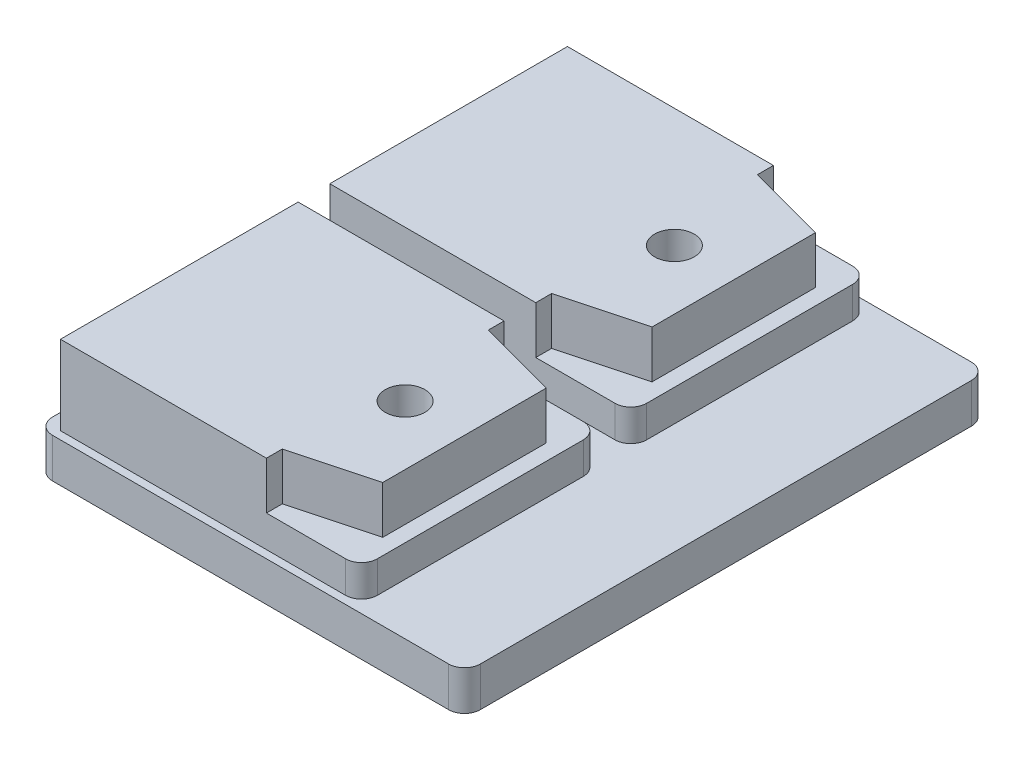
ISO-10303-21;
HEADER;
FILE_DESCRIPTION(('STEP AP214'),'2;1');
FILE_NAME('part.step','',(''),(''),'','','');
FILE_SCHEMA(('AUTOMOTIVE_DESIGN { 1 0 10303 214 1 1 1 1 }'));
ENDSEC;
DATA;
#1=APPLICATION_CONTEXT('core data for automotive mechanical design processes');
#2=APPLICATION_PROTOCOL_DEFINITION('international standard','automotive_design',2000,#1);
#3=PRODUCT_CONTEXT('',#1,'mechanical');
#4=PRODUCT('Part','Part','',(#3));
#5=PRODUCT_RELATED_PRODUCT_CATEGORY('part','',(#4));
#6=PRODUCT_DEFINITION_FORMATION('','',#4);
#7=PRODUCT_DEFINITION_CONTEXT('part definition',#1,'design');
#8=PRODUCT_DEFINITION('design','',#6,#7);
#9=PRODUCT_DEFINITION_SHAPE('','',#8);
#10=(LENGTH_UNIT() NAMED_UNIT(*) SI_UNIT(.MILLI.,.METRE.));
#11=(NAMED_UNIT(*) PLANE_ANGLE_UNIT() SI_UNIT($,.RADIAN.));
#12=(NAMED_UNIT(*) SI_UNIT($,.STERADIAN.) SOLID_ANGLE_UNIT());
#13=UNCERTAINTY_MEASURE_WITH_UNIT(LENGTH_MEASURE(1.E-05),#10,'distance_accuracy_value','');
#14=(GEOMETRIC_REPRESENTATION_CONTEXT(3) GLOBAL_UNCERTAINTY_ASSIGNED_CONTEXT((#13)) GLOBAL_UNIT_ASSIGNED_CONTEXT((#10,
#11,#12)) REPRESENTATION_CONTEXT('',''));
#15=CARTESIAN_POINT('',(0.,0.,0.));
#16=DIRECTION('',(0.,0.,1.));
#17=DIRECTION('',(1.,0.,0.));
#18=AXIS2_PLACEMENT_3D('',#15,#16,#17);
#19=CARTESIAN_POINT('',(6.5,7.5,-1.));
#20=DIRECTION('',(-1.,0.,0.));
#21=DIRECTION('',(0.,0.,1.));
#22=AXIS2_PLACEMENT_3D('',#19,#20,#21);
#23=PLANE('',#22);
#24=DIRECTION('',(0.,0.,-1.));
#25=VECTOR('',#24,1.);
#26=CARTESIAN_POINT('',(6.5,2.5,-1.));
#27=LINE('',#26,#25);
#28=CARTESIAN_POINT('',(6.5,2.5,-2.));
#29=VERTEX_POINT('',#28);
#30=CARTESIAN_POINT('',(6.5,2.5,-15.));
#31=VERTEX_POINT('',#30);
#32=EDGE_CURVE('E297',#29,#31,#27,.T.);
#33=ORIENTED_EDGE('',*,*,#32,.T.);
#34=DIRECTION('',(0.,-1.,0.));
#35=VECTOR('',#34,1.);
#36=CARTESIAN_POINT('',(6.5,7.5,-15.));
#37=LINE('',#36,#35);
#38=CARTESIAN_POINT('',(6.5,4.5,-15.));
#39=VERTEX_POINT('',#38);
#40=EDGE_CURVE('E465',#31,#39,#37,.F.);
#41=ORIENTED_EDGE('',*,*,#40,.T.);
#42=DIRECTION('',(0.,0.,-1.));
#43=VECTOR('',#42,1.);
#44=CARTESIAN_POINT('',(6.5,4.5,-1.));
#45=LINE('',#44,#43);
#46=CARTESIAN_POINT('',(6.5,4.5,-2.));
#47=VERTEX_POINT('',#46);
#48=EDGE_CURVE('E260',#47,#39,#45,.T.);
#49=ORIENTED_EDGE('',*,*,#48,.F.);
#50=DIRECTION('',(0.,-1.,0.));
#51=VECTOR('',#50,1.);
#52=CARTESIAN_POINT('',(6.5,7.5,-2.));
#53=LINE('',#52,#51);
#54=EDGE_CURVE('E462',#47,#29,#53,.T.);
#55=ORIENTED_EDGE('',*,*,#54,.T.);
#56=EDGE_LOOP('',(#33,#41,#49,#55));
#57=FACE_BOUND('',#56,.T.);
#58=ADVANCED_FACE('F39',(#57),#23,.F.);
#59=CARTESIAN_POINT('',(-13.5,2.5,16.5));
#60=DIRECTION('',(0.,1.,0.));
#61=DIRECTION('',(0.,0.,1.));
#62=AXIS2_PLACEMENT_3D('',#59,#60,#61);
#63=PLANE('',#62);
#64=CARTESIAN_POINT('',(5.5,2.5,-2.));
#65=DIRECTION('',(0.,1.,0.));
#66=DIRECTION('',(0.,0.,1.));
#67=AXIS2_PLACEMENT_3D('',#64,#65,#66);
#68=CIRCLE('',#67,1.);
#69=CARTESIAN_POINT('',(5.5,2.5,-1.));
#70=VERTEX_POINT('',#69);
#71=EDGE_CURVE('E11',#29,#70,#68,.F.);
#72=ORIENTED_EDGE('',*,*,#71,.T.);
#73=DIRECTION('',(1.,0.,0.));
#74=VECTOR('',#73,1.);
#75=CARTESIAN_POINT('',(-12.5,2.5,-1.));
#76=LINE('',#75,#74);
#77=CARTESIAN_POINT('',(-12.5,2.5,-1.));
#78=VERTEX_POINT('',#77);
#79=EDGE_CURVE('E55',#78,#70,#76,.T.);
#80=ORIENTED_EDGE('',*,*,#79,.F.);
#81=DIRECTION('',(0.,0.,1.));
#82=VECTOR('',#81,1.);
#83=CARTESIAN_POINT('',(-12.5,2.5,-1.));
#84=LINE('',#83,#82);
#85=CARTESIAN_POINT('',(-12.5,2.5,-16.));
#86=VERTEX_POINT('',#85);
#87=EDGE_CURVE('E292',#86,#78,#84,.T.);
#88=ORIENTED_EDGE('',*,*,#87,.F.);
#89=DIRECTION('',(-1.,0.,0.));
#90=VECTOR('',#89,1.);
#91=CARTESIAN_POINT('',(-12.5,2.5,-16.));
#92=LINE('',#91,#90);
#93=CARTESIAN_POINT('',(5.5,2.5,-16.));
#94=VERTEX_POINT('',#93);
#95=EDGE_CURVE('E287',#94,#86,#92,.T.);
#96=ORIENTED_EDGE('',*,*,#95,.F.);
#97=CARTESIAN_POINT('',(5.5,2.5,-15.));
#98=DIRECTION('',(0.,1.,0.));
#99=DIRECTION('',(0.,0.,1.));
#100=AXIS2_PLACEMENT_3D('',#97,#98,#99);
#101=CIRCLE('',#100,1.);
#102=EDGE_CURVE('E48',#94,#31,#101,.F.);
#103=ORIENTED_EDGE('',*,*,#102,.T.);
#104=ORIENTED_EDGE('',*,*,#32,.F.);
#105=EDGE_LOOP('',(#72,#80,#88,#96,#103,#104));
#106=FACE_BOUND('',#105,.T.);
#107=DIRECTION('',(0.,0.,1.));
#108=VECTOR('',#107,1.);
#109=CARTESIAN_POINT('',(-12.5,2.5,16.));
#110=LINE('',#109,#108);
#111=CARTESIAN_POINT('',(-12.5,2.5,1.));
#112=VERTEX_POINT('',#111);
#113=CARTESIAN_POINT('',(-12.5,2.5,16.));
#114=VERTEX_POINT('',#113);
#115=EDGE_CURVE('E349',#112,#114,#110,.T.);
#116=ORIENTED_EDGE('',*,*,#115,.F.);
#117=DIRECTION('',(-1.,0.,0.));
#118=VECTOR('',#117,1.);
#119=CARTESIAN_POINT('',(-12.5,2.5,1.));
#120=LINE('',#119,#118);
#121=CARTESIAN_POINT('',(5.5,2.5,0.999999999999999));
#122=VERTEX_POINT('',#121);
#123=EDGE_CURVE('E363',#122,#112,#120,.T.);
#124=ORIENTED_EDGE('',*,*,#123,.F.);
#125=CARTESIAN_POINT('',(5.5,2.5,2.));
#126=DIRECTION('',(0.,1.,0.));
#127=DIRECTION('',(0.,0.,1.));
#128=AXIS2_PLACEMENT_3D('',#125,#126,#127);
#129=CIRCLE('',#128,1.);
#130=CARTESIAN_POINT('',(6.5,2.5,2.));
#131=VERTEX_POINT('',#130);
#132=EDGE_CURVE('E456',#122,#131,#129,.F.);
#133=ORIENTED_EDGE('',*,*,#132,.T.);
#134=DIRECTION('',(0.,0.,-1.));
#135=VECTOR('',#134,1.);
#136=CARTESIAN_POINT('',(6.5,2.5,16.));
#137=LINE('',#136,#135);
#138=CARTESIAN_POINT('',(6.5,2.5,15.));
#139=VERTEX_POINT('',#138);
#140=EDGE_CURVE('E374',#139,#131,#137,.T.);
#141=ORIENTED_EDGE('',*,*,#140,.F.);
#142=CARTESIAN_POINT('',(5.5,2.5,15.));
#143=DIRECTION('',(0.,1.,0.));
#144=DIRECTION('',(0.,0.,1.));
#145=AXIS2_PLACEMENT_3D('',#142,#143,#144);
#146=CIRCLE('',#145,1.);
#147=CARTESIAN_POINT('',(5.5,2.5,16.));
#148=VERTEX_POINT('',#147);
#149=EDGE_CURVE('E458',#139,#148,#146,.F.);
#150=ORIENTED_EDGE('',*,*,#149,.T.);
#151=DIRECTION('',(1.,0.,0.));
#152=VECTOR('',#151,1.);
#153=CARTESIAN_POINT('',(-12.5,2.5,16.));
#154=LINE('',#153,#152);
#155=EDGE_CURVE('E371',#114,#148,#154,.T.);
#156=ORIENTED_EDGE('',*,*,#155,.F.);
#157=EDGE_LOOP('',(#116,#124,#133,#141,#150,#156));
#158=FACE_BOUND('',#157,.T.);
#159=DIRECTION('',(0.,0.,-1.));
#160=VECTOR('',#159,1.);
#161=CARTESIAN_POINT('',(13.5,2.5,-16.5));
#162=LINE('',#161,#160);
#163=CARTESIAN_POINT('',(13.5,2.5,15.5));
#164=VERTEX_POINT('',#163);
#165=CARTESIAN_POINT('',(13.5,2.5,-15.5));
#166=VERTEX_POINT('',#165);
#167=EDGE_CURVE('E390',#164,#166,#162,.T.);
#168=ORIENTED_EDGE('',*,*,#167,.T.);
#169=CARTESIAN_POINT('',(12.5,2.5,-15.5));
#170=DIRECTION('',(0.,1.,0.));
#171=DIRECTION('',(0.,0.,1.));
#172=AXIS2_PLACEMENT_3D('',#169,#170,#171);
#173=CIRCLE('',#172,1.);
#174=CARTESIAN_POINT('',(12.5,2.5,-16.5));
#175=VERTEX_POINT('',#174);
#176=EDGE_CURVE('E430',#166,#175,#173,.T.);
#177=ORIENTED_EDGE('',*,*,#176,.T.);
#178=DIRECTION('',(-1.,0.,0.));
#179=VECTOR('',#178,1.);
#180=CARTESIAN_POINT('',(-13.5,2.5,-16.5));
#181=LINE('',#180,#179);
#182=CARTESIAN_POINT('',(-12.5,2.5,-16.5));
#183=VERTEX_POINT('',#182);
#184=EDGE_CURVE('E393',#175,#183,#181,.T.);
#185=ORIENTED_EDGE('',*,*,#184,.T.);
#186=CARTESIAN_POINT('',(-12.5,2.5,-15.5));
#187=DIRECTION('',(0.,1.,0.));
#188=DIRECTION('',(0.,0.,1.));
#189=AXIS2_PLACEMENT_3D('',#186,#187,#188);
#190=CIRCLE('',#189,1.);
#191=CARTESIAN_POINT('',(-13.5,2.5,-15.5));
#192=VERTEX_POINT('',#191);
#193=EDGE_CURVE('E428',#183,#192,#190,.T.);
#194=ORIENTED_EDGE('',*,*,#193,.T.);
#195=DIRECTION('',(0.,0.,1.));
#196=VECTOR('',#195,1.);
#197=CARTESIAN_POINT('',(-13.5,2.5,-16.5));
#198=LINE('',#197,#196);
#199=CARTESIAN_POINT('',(-13.5,2.5,15.5));
#200=VERTEX_POINT('',#199);
#201=EDGE_CURVE('E383',#192,#200,#198,.T.);
#202=ORIENTED_EDGE('',*,*,#201,.T.);
#203=CARTESIAN_POINT('',(-12.5,2.5,15.5));
#204=DIRECTION('',(0.,1.,0.));
#205=DIRECTION('',(0.,0.,1.));
#206=AXIS2_PLACEMENT_3D('',#203,#204,#205);
#207=CIRCLE('',#206,1.);
#208=CARTESIAN_POINT('',(-12.5,2.5,16.5));
#209=VERTEX_POINT('',#208);
#210=EDGE_CURVE('E426',#200,#209,#207,.T.);
#211=ORIENTED_EDGE('',*,*,#210,.T.);
#212=DIRECTION('',(1.,0.,0.));
#213=VECTOR('',#212,1.);
#214=CARTESIAN_POINT('',(-13.5,2.5,16.5));
#215=LINE('',#214,#213);
#216=CARTESIAN_POINT('',(12.5,2.5,16.5));
#217=VERTEX_POINT('',#216);
#218=EDGE_CURVE('E386',#209,#217,#215,.T.);
#219=ORIENTED_EDGE('',*,*,#218,.T.);
#220=CARTESIAN_POINT('',(12.5,2.5,15.5));
#221=DIRECTION('',(0.,1.,0.));
#222=DIRECTION('',(0.,0.,1.));
#223=AXIS2_PLACEMENT_3D('',#220,#221,#222);
#224=CIRCLE('',#223,1.);
#225=EDGE_CURVE('E424',#217,#164,#224,.T.);
#226=ORIENTED_EDGE('',*,*,#225,.T.);
#227=EDGE_LOOP('',(#168,#177,#185,#194,#202,#211,#219,#226));
#228=FACE_BOUND('',#227,.T.);
#229=ADVANCED_FACE('F474',(#106,#158,#228),#63,.T.);
#230=CARTESIAN_POINT('',(6.5,7.5,16.));
#231=DIRECTION('',(-1.,0.,0.));
#232=DIRECTION('',(0.,0.,1.));
#233=AXIS2_PLACEMENT_3D('',#230,#231,#232);
#234=PLANE('',#233);
#235=ORIENTED_EDGE('',*,*,#140,.T.);
#236=DIRECTION('',(0.,-1.,0.));
#237=VECTOR('',#236,1.);
#238=CARTESIAN_POINT('',(6.5,7.5,2.));
#239=LINE('',#238,#237);
#240=CARTESIAN_POINT('',(6.5,4.5,2.));
#241=VERTEX_POINT('',#240);
#242=EDGE_CURVE('E448',#131,#241,#239,.F.);
#243=ORIENTED_EDGE('',*,*,#242,.T.);
#244=DIRECTION('',(0.,0.,-1.));
#245=VECTOR('',#244,1.);
#246=CARTESIAN_POINT('',(6.5,4.5,16.));
#247=LINE('',#246,#245);
#248=CARTESIAN_POINT('',(6.5,4.5,15.));
#249=VERTEX_POINT('',#248);
#250=EDGE_CURVE('E309',#249,#241,#247,.T.);
#251=ORIENTED_EDGE('',*,*,#250,.F.);
#252=DIRECTION('',(0.,-1.,0.));
#253=VECTOR('',#252,1.);
#254=CARTESIAN_POINT('',(6.5,7.5,15.));
#255=LINE('',#254,#253);
#256=EDGE_CURVE('E445',#249,#139,#255,.T.);
#257=ORIENTED_EDGE('',*,*,#256,.T.);
#258=EDGE_LOOP('',(#235,#243,#251,#257));
#259=FACE_BOUND('',#258,.T.);
#260=ADVANCED_FACE('F554',(#259),#234,.F.);
#261=CARTESIAN_POINT('',(-13.5,2.5,-16.5));
#262=DIRECTION('',(1.,0.,0.));
#263=DIRECTION('',(0.,0.,-1.));
#264=AXIS2_PLACEMENT_3D('',#261,#262,#263);
#265=PLANE('',#264);
#266=ORIENTED_EDGE('',*,*,#201,.F.);
#267=DIRECTION('',(0.,-1.,0.));
#268=VECTOR('',#267,1.);
#269=CARTESIAN_POINT('',(-13.5,2.5,-15.5));
#270=LINE('',#269,#268);
#271=CARTESIAN_POINT('',(-13.5,0.,-15.5));
#272=VERTEX_POINT('',#271);
#273=EDGE_CURVE('E434',#192,#272,#270,.T.);
#274=ORIENTED_EDGE('',*,*,#273,.T.);
#275=DIRECTION('',(0.,0.,1.));
#276=VECTOR('',#275,1.);
#277=CARTESIAN_POINT('',(-13.5,0.,-16.5));
#278=LINE('',#277,#276);
#279=CARTESIAN_POINT('',(-13.5,0.,15.5));
#280=VERTEX_POINT('',#279);
#281=EDGE_CURVE('E382',#272,#280,#278,.T.);
#282=ORIENTED_EDGE('',*,*,#281,.T.);
#283=DIRECTION('',(0.,-1.,0.));
#284=VECTOR('',#283,1.);
#285=CARTESIAN_POINT('',(-13.5,2.5,15.5));
#286=LINE('',#285,#284);
#287=EDGE_CURVE('E432',#280,#200,#286,.F.);
#288=ORIENTED_EDGE('',*,*,#287,.T.);
#289=EDGE_LOOP('',(#266,#274,#282,#288));
#290=FACE_BOUND('',#289,.T.);
#291=ADVANCED_FACE('F603',(#290),#265,.F.);
#292=CARTESIAN_POINT('',(-13.5,2.5,16.5));
#293=DIRECTION('',(0.,0.,-1.));
#294=DIRECTION('',(-1.,0.,0.));
#295=AXIS2_PLACEMENT_3D('',#292,#293,#294);
#296=PLANE('',#295);
#297=ORIENTED_EDGE('',*,*,#218,.F.);
#298=DIRECTION('',(0.,-1.,0.));
#299=VECTOR('',#298,1.);
#300=CARTESIAN_POINT('',(-12.5,2.5,16.5));
#301=LINE('',#300,#299);
#302=CARTESIAN_POINT('',(-12.5,0.,16.5));
#303=VERTEX_POINT('',#302);
#304=EDGE_CURVE('E439',#209,#303,#301,.T.);
#305=ORIENTED_EDGE('',*,*,#304,.T.);
#306=DIRECTION('',(1.,0.,0.));
#307=VECTOR('',#306,1.);
#308=CARTESIAN_POINT('',(-13.5,0.,16.5));
#309=LINE('',#308,#307);
#310=CARTESIAN_POINT('',(12.5,0.,16.5));
#311=VERTEX_POINT('',#310);
#312=EDGE_CURVE('E399',#303,#311,#309,.T.);
#313=ORIENTED_EDGE('',*,*,#312,.T.);
#314=DIRECTION('',(0.,-1.,0.));
#315=VECTOR('',#314,1.);
#316=CARTESIAN_POINT('',(12.5,2.5,16.5));
#317=LINE('',#316,#315);
#318=EDGE_CURVE('E437',#311,#217,#317,.F.);
#319=ORIENTED_EDGE('',*,*,#318,.T.);
#320=EDGE_LOOP('',(#297,#305,#313,#319));
#321=FACE_BOUND('',#320,.T.);
#322=ADVANCED_FACE('F625',(#321),#296,.F.);
#323=CARTESIAN_POINT('',(13.5,2.5,-16.5));
#324=DIRECTION('',(-1.,0.,0.));
#325=DIRECTION('',(0.,0.,1.));
#326=AXIS2_PLACEMENT_3D('',#323,#324,#325);
#327=PLANE('',#326);
#328=DIRECTION('',(0.,0.,-1.));
#329=VECTOR('',#328,1.);
#330=CARTESIAN_POINT('',(13.5,0.,-16.5));
#331=LINE('',#330,#329);
#332=CARTESIAN_POINT('',(13.5,0.,15.5));
#333=VERTEX_POINT('',#332);
#334=CARTESIAN_POINT('',(13.5,0.,-15.5));
#335=VERTEX_POINT('',#334);
#336=EDGE_CURVE('E402',#333,#335,#331,.T.);
#337=ORIENTED_EDGE('',*,*,#336,.T.);
#338=DIRECTION('',(0.,-1.,0.));
#339=VECTOR('',#338,1.);
#340=CARTESIAN_POINT('',(13.5,2.5,-15.5));
#341=LINE('',#340,#339);
#342=EDGE_CURVE('E422',#335,#166,#341,.F.);
#343=ORIENTED_EDGE('',*,*,#342,.T.);
#344=ORIENTED_EDGE('',*,*,#167,.F.);
#345=DIRECTION('',(0.,-1.,0.));
#346=VECTOR('',#345,1.);
#347=CARTESIAN_POINT('',(13.5,2.5,15.5));
#348=LINE('',#347,#346);
#349=EDGE_CURVE('E419',#164,#333,#348,.T.);
#350=ORIENTED_EDGE('',*,*,#349,.T.);
#351=EDGE_LOOP('',(#337,#343,#344,#350));
#352=FACE_BOUND('',#351,.T.);
#353=ADVANCED_FACE('F621',(#352),#327,.F.);
#354=CARTESIAN_POINT('',(-13.5,2.5,-16.5));
#355=DIRECTION('',(0.,0.,1.));
#356=DIRECTION('',(1.,0.,0.));
#357=AXIS2_PLACEMENT_3D('',#354,#355,#356);
#358=PLANE('',#357);
#359=ORIENTED_EDGE('',*,*,#184,.F.);
#360=DIRECTION('',(0.,-1.,0.));
#361=VECTOR('',#360,1.);
#362=CARTESIAN_POINT('',(12.5,2.5,-16.5));
#363=LINE('',#362,#361);
#364=CARTESIAN_POINT('',(12.5,0.,-16.5));
#365=VERTEX_POINT('',#364);
#366=EDGE_CURVE('E408',#175,#365,#363,.T.);
#367=ORIENTED_EDGE('',*,*,#366,.T.);
#368=DIRECTION('',(-1.,0.,0.));
#369=VECTOR('',#368,1.);
#370=CARTESIAN_POINT('',(-13.5,0.,-16.5));
#371=LINE('',#370,#369);
#372=CARTESIAN_POINT('',(-12.5,0.,-16.5));
#373=VERTEX_POINT('',#372);
#374=EDGE_CURVE('E387',#365,#373,#371,.T.);
#375=ORIENTED_EDGE('',*,*,#374,.T.);
#376=DIRECTION('',(0.,-1.,0.));
#377=VECTOR('',#376,1.);
#378=CARTESIAN_POINT('',(-12.5,2.5,-16.5));
#379=LINE('',#378,#377);
#380=EDGE_CURVE('E396',#373,#183,#379,.F.);
#381=ORIENTED_EDGE('',*,*,#380,.T.);
#382=EDGE_LOOP('',(#359,#367,#375,#381));
#383=FACE_BOUND('',#382,.T.);
#384=ADVANCED_FACE('F617',(#383),#358,.F.);
#385=CARTESIAN_POINT('',(-13.5,0.,16.5));
#386=DIRECTION('',(0.,1.,0.));
#387=DIRECTION('',(0.,0.,1.));
#388=AXIS2_PLACEMENT_3D('',#385,#386,#387);
#389=PLANE('',#388);
#390=ORIENTED_EDGE('',*,*,#374,.F.);
#391=CARTESIAN_POINT('',(12.5,0.,-15.5));
#392=DIRECTION('',(0.,1.,0.));
#393=DIRECTION('',(0.,0.,1.));
#394=AXIS2_PLACEMENT_3D('',#391,#392,#393);
#395=CIRCLE('',#394,1.);
#396=EDGE_CURVE('E417',#365,#335,#395,.F.);
#397=ORIENTED_EDGE('',*,*,#396,.T.);
#398=ORIENTED_EDGE('',*,*,#336,.F.);
#399=CARTESIAN_POINT('',(12.5,0.,15.5));
#400=DIRECTION('',(0.,1.,0.));
#401=DIRECTION('',(0.,0.,1.));
#402=AXIS2_PLACEMENT_3D('',#399,#400,#401);
#403=CIRCLE('',#402,1.);
#404=EDGE_CURVE('E411',#333,#311,#403,.F.);
#405=ORIENTED_EDGE('',*,*,#404,.T.);
#406=ORIENTED_EDGE('',*,*,#312,.F.);
#407=CARTESIAN_POINT('',(-12.5,0.,15.5));
#408=DIRECTION('',(0.,1.,0.));
#409=DIRECTION('',(0.,0.,1.));
#410=AXIS2_PLACEMENT_3D('',#407,#408,#409);
#411=CIRCLE('',#410,1.);
#412=EDGE_CURVE('E413',#303,#280,#411,.F.);
#413=ORIENTED_EDGE('',*,*,#412,.T.);
#414=ORIENTED_EDGE('',*,*,#281,.F.);
#415=CARTESIAN_POINT('',(-12.5,0.,-15.5));
#416=DIRECTION('',(0.,1.,0.));
#417=DIRECTION('',(0.,0.,1.));
#418=AXIS2_PLACEMENT_3D('',#415,#416,#417);
#419=CIRCLE('',#418,1.);
#420=EDGE_CURVE('E415',#272,#373,#419,.F.);
#421=ORIENTED_EDGE('',*,*,#420,.T.);
#422=EDGE_LOOP('',(#390,#397,#398,#405,#406,#413,#414,#421));
#423=FACE_BOUND('',#422,.T.);
#424=ADVANCED_FACE('F613',(#423),#389,.F.);
#425=CARTESIAN_POINT('',(12.5,2.5,-15.5));
#426=DIRECTION('',(0.,-1.,0.));
#427=DIRECTION('',(0.,0.,-1.));
#428=AXIS2_PLACEMENT_3D('',#425,#426,#427);
#429=CYLINDRICAL_SURFACE('',#428,1.);
#430=ORIENTED_EDGE('',*,*,#176,.F.);
#431=ORIENTED_EDGE('',*,*,#342,.F.);
#432=ORIENTED_EDGE('',*,*,#396,.F.);
#433=ORIENTED_EDGE('',*,*,#366,.F.);
#434=EDGE_LOOP('',(#430,#431,#432,#433));
#435=FACE_BOUND('',#434,.T.);
#436=ADVANCED_FACE('F616',(#435),#429,.T.);
#437=CARTESIAN_POINT('',(-12.5,2.5,-15.5));
#438=DIRECTION('',(0.,-1.,0.));
#439=DIRECTION('',(0.,0.,-1.));
#440=AXIS2_PLACEMENT_3D('',#437,#438,#439);
#441=CYLINDRICAL_SURFACE('',#440,1.);
#442=ORIENTED_EDGE('',*,*,#193,.F.);
#443=ORIENTED_EDGE('',*,*,#380,.F.);
#444=ORIENTED_EDGE('',*,*,#420,.F.);
#445=ORIENTED_EDGE('',*,*,#273,.F.);
#446=EDGE_LOOP('',(#442,#443,#444,#445));
#447=FACE_BOUND('',#446,.T.);
#448=ADVANCED_FACE('F635',(#447),#441,.T.);
#449=CARTESIAN_POINT('',(-12.5,2.5,15.5));
#450=DIRECTION('',(0.,-1.,0.));
#451=DIRECTION('',(0.,0.,-1.));
#452=AXIS2_PLACEMENT_3D('',#449,#450,#451);
#453=CYLINDRICAL_SURFACE('',#452,1.);
#454=ORIENTED_EDGE('',*,*,#210,.F.);
#455=ORIENTED_EDGE('',*,*,#287,.F.);
#456=ORIENTED_EDGE('',*,*,#412,.F.);
#457=ORIENTED_EDGE('',*,*,#304,.F.);
#458=EDGE_LOOP('',(#454,#455,#456,#457));
#459=FACE_BOUND('',#458,.T.);
#460=ADVANCED_FACE('F639',(#459),#453,.T.);
#461=CARTESIAN_POINT('',(12.5,2.5,15.5));
#462=DIRECTION('',(0.,-1.,0.));
#463=DIRECTION('',(0.,0.,-1.));
#464=AXIS2_PLACEMENT_3D('',#461,#462,#463);
#465=CYLINDRICAL_SURFACE('',#464,1.);
#466=ORIENTED_EDGE('',*,*,#225,.F.);
#467=ORIENTED_EDGE('',*,*,#318,.F.);
#468=ORIENTED_EDGE('',*,*,#404,.F.);
#469=ORIENTED_EDGE('',*,*,#349,.F.);
#470=EDGE_LOOP('',(#466,#467,#468,#469));
#471=FACE_BOUND('',#470,.T.);
#472=ADVANCED_FACE('F610',(#471),#465,.T.);
#473=CARTESIAN_POINT('',(-12.5,7.5,16.));
#474=DIRECTION('',(1.,0.,0.));
#475=DIRECTION('',(0.,0.,-1.));
#476=AXIS2_PLACEMENT_3D('',#473,#474,#475);
#477=PLANE('',#476);
#478=ORIENTED_EDGE('',*,*,#115,.T.);
#479=DIRECTION('',(0.,-1.,0.));
#480=VECTOR('',#479,1.);
#481=CARTESIAN_POINT('',(-12.5,7.5,16.));
#482=LINE('',#481,#480);
#483=CARTESIAN_POINT('',(-12.5,7.5,16.));
#484=VERTEX_POINT('',#483);
#485=EDGE_CURVE('E380',#484,#114,#482,.T.);
#486=ORIENTED_EDGE('',*,*,#485,.F.);
#487=DIRECTION('',(0.,0.,1.));
#488=VECTOR('',#487,1.);
#489=CARTESIAN_POINT('',(-12.5,7.5,16.));
#490=LINE('',#489,#488);
#491=CARTESIAN_POINT('',(-12.5,7.5,1.));
#492=VERTEX_POINT('',#491);
#493=EDGE_CURVE('E359',#492,#484,#490,.T.);
#494=ORIENTED_EDGE('',*,*,#493,.F.);
#495=DIRECTION('',(0.,-1.,0.));
#496=VECTOR('',#495,1.);
#497=CARTESIAN_POINT('',(-12.5,7.5,1.));
#498=LINE('',#497,#496);
#499=EDGE_CURVE('E368',#492,#112,#498,.T.);
#500=ORIENTED_EDGE('',*,*,#499,.T.);
#501=EDGE_LOOP('',(#478,#486,#494,#500));
#502=FACE_BOUND('',#501,.T.);
#503=ADVANCED_FACE('F607',(#502),#477,.F.);
#504=CARTESIAN_POINT('',(-12.5,7.5,16.));
#505=DIRECTION('',(0.,0.,-1.));
#506=DIRECTION('',(-1.,0.,0.));
#507=AXIS2_PLACEMENT_3D('',#504,#505,#506);
#508=PLANE('',#507);
#509=ORIENTED_EDGE('',*,*,#155,.T.);
#510=DIRECTION('',(0.,-1.,0.));
#511=VECTOR('',#510,1.);
#512=CARTESIAN_POINT('',(5.5,7.5,16.));
#513=LINE('',#512,#511);
#514=CARTESIAN_POINT('',(5.5,4.5,16.));
#515=VERTEX_POINT('',#514);
#516=EDGE_CURVE('E454',#148,#515,#513,.F.);
#517=ORIENTED_EDGE('',*,*,#516,.T.);
#518=DIRECTION('',(1.,0.,0.));
#519=VECTOR('',#518,1.);
#520=CARTESIAN_POINT('',(0.499999999999999,4.5,16.));
#521=LINE('',#520,#519);
#522=CARTESIAN_POINT('',(0.499999999999999,4.5,16.));
#523=VERTEX_POINT('',#522);
#524=EDGE_CURVE('E330',#523,#515,#521,.T.);
#525=ORIENTED_EDGE('',*,*,#524,.F.);
#526=DIRECTION('',(0.,1.,0.));
#527=VECTOR('',#526,1.);
#528=CARTESIAN_POINT('',(0.499999999999999,4.5,16.));
#529=LINE('',#528,#527);
#530=CARTESIAN_POINT('',(0.499999999999999,7.5,16.));
#531=VERTEX_POINT('',#530);
#532=EDGE_CURVE('E346',#523,#531,#529,.T.);
#533=ORIENTED_EDGE('',*,*,#532,.T.);
#534=DIRECTION('',(1.,0.,0.));
#535=VECTOR('',#534,1.);
#536=CARTESIAN_POINT('',(-12.5,7.5,16.));
#537=LINE('',#536,#535);
#538=EDGE_CURVE('E362',#484,#531,#537,.T.);
#539=ORIENTED_EDGE('',*,*,#538,.F.);
#540=ORIENTED_EDGE('',*,*,#485,.T.);
#541=EDGE_LOOP('',(#509,#517,#525,#533,#539,#540));
#542=FACE_BOUND('',#541,.T.);
#543=ADVANCED_FACE('F599',(#542),#508,.F.);
#544=CARTESIAN_POINT('',(-12.5,7.5,1.));
#545=DIRECTION('',(0.,0.,1.));
#546=DIRECTION('',(1.,0.,0.));
#547=AXIS2_PLACEMENT_3D('',#544,#545,#546);
#548=PLANE('',#547);
#549=DIRECTION('',(-1.,0.,0.));
#550=VECTOR('',#549,1.);
#551=CARTESIAN_POINT('',(6.5,4.5,0.999999999999999));
#552=LINE('',#551,#550);
#553=CARTESIAN_POINT('',(5.5,4.5,0.999999999999999));
#554=VERTEX_POINT('',#553);
#555=CARTESIAN_POINT('',(0.499999999999999,4.5,0.999999999999999));
#556=VERTEX_POINT('',#555);
#557=EDGE_CURVE('E312',#554,#556,#552,.T.);
#558=ORIENTED_EDGE('',*,*,#557,.F.);
#559=DIRECTION('',(0.,-1.,0.));
#560=VECTOR('',#559,1.);
#561=CARTESIAN_POINT('',(5.5,7.5,0.999999999999999));
#562=LINE('',#561,#560);
#563=EDGE_CURVE('E442',#554,#122,#562,.T.);
#564=ORIENTED_EDGE('',*,*,#563,.T.);
#565=ORIENTED_EDGE('',*,*,#123,.T.);
#566=ORIENTED_EDGE('',*,*,#499,.F.);
#567=DIRECTION('',(-1.,0.,0.));
#568=VECTOR('',#567,1.);
#569=CARTESIAN_POINT('',(-12.5,7.5,1.));
#570=LINE('',#569,#568);
#571=CARTESIAN_POINT('',(0.499999999999999,7.5,0.999999999999999));
#572=VERTEX_POINT('',#571);
#573=EDGE_CURVE('E366',#572,#492,#570,.T.);
#574=ORIENTED_EDGE('',*,*,#573,.F.);
#575=DIRECTION('',(0.,1.,0.));
#576=VECTOR('',#575,1.);
#577=CARTESIAN_POINT('',(0.499999999999999,4.5,0.999999999999999));
#578=LINE('',#577,#576);
#579=EDGE_CURVE('E333',#556,#572,#578,.T.);
#580=ORIENTED_EDGE('',*,*,#579,.F.);
#581=EDGE_LOOP('',(#558,#564,#565,#566,#574,#580));
#582=FACE_BOUND('',#581,.T.);
#583=ADVANCED_FACE('F595',(#582),#548,.F.);
#584=CARTESIAN_POINT('',(-12.5,7.5,1.));
#585=DIRECTION('',(0.,-1.,0.));
#586=DIRECTION('',(0.,0.,-1.));
#587=AXIS2_PLACEMENT_3D('',#584,#585,#586);
#588=PLANE('',#587);
#589=CARTESIAN_POINT('',(1.75,7.5,8.5));
#590=DIRECTION('',(0.,1.,0.));
#591=DIRECTION('',(0.,0.,1.));
#592=AXIS2_PLACEMENT_3D('',#589,#590,#591);
#593=CIRCLE('',#592,1.25);
#594=CARTESIAN_POINT('',(1.75,7.5,9.75));
#595=VERTEX_POINT('',#594);
#596=EDGE_CURVE('E305',#595,#595,#593,.T.);
#597=ORIENTED_EDGE('',*,*,#596,.F.);
#598=EDGE_LOOP('',(#597));
#599=FACE_BOUND('',#598,.T.);
#600=ORIENTED_EDGE('',*,*,#538,.T.);
#601=DIRECTION('',(0.,0.,1.));
#602=VECTOR('',#601,1.);
#603=CARTESIAN_POINT('',(0.499999999999999,7.5,15.));
#604=LINE('',#603,#602);
#605=CARTESIAN_POINT('',(0.499999999999999,7.5,15.));
#606=VERTEX_POINT('',#605);
#607=EDGE_CURVE('E313',#606,#531,#604,.T.);
#608=ORIENTED_EDGE('',*,*,#607,.F.);
#609=DIRECTION('',(-0.965925826289069,0.,0.258819045102519));
#610=VECTOR('',#609,1.);
#611=CARTESIAN_POINT('',(5.5,7.5,13.6602540378444));
#612=LINE('',#611,#610);
#613=CARTESIAN_POINT('',(5.5,7.5,13.6602540378444));
#614=VERTEX_POINT('',#613);
#615=EDGE_CURVE('E342',#614,#606,#612,.T.);
#616=ORIENTED_EDGE('',*,*,#615,.F.);
#617=DIRECTION('',(0.,0.,1.));
#618=VECTOR('',#617,1.);
#619=CARTESIAN_POINT('',(5.5,7.5,3.3397459621556));
#620=LINE('',#619,#618);
#621=CARTESIAN_POINT('',(5.5,7.5,3.3397459621556));
#622=VERTEX_POINT('',#621);
#623=EDGE_CURVE('E339',#622,#614,#620,.T.);
#624=ORIENTED_EDGE('',*,*,#623,.F.);
#625=DIRECTION('',(0.965925826289069,0.,0.258819045102519));
#626=VECTOR('',#625,1.);
#627=CARTESIAN_POINT('',(0.499999999999999,7.5,2.));
#628=LINE('',#627,#626);
#629=CARTESIAN_POINT('',(0.499999999999999,7.5,2.));
#630=VERTEX_POINT('',#629);
#631=EDGE_CURVE('E336',#630,#622,#628,.T.);
#632=ORIENTED_EDGE('',*,*,#631,.F.);
#633=DIRECTION('',(0.,0.,1.));
#634=VECTOR('',#633,1.);
#635=CARTESIAN_POINT('',(0.499999999999999,7.5,0.999999999999999));
#636=LINE('',#635,#634);
#637=EDGE_CURVE('E308',#572,#630,#636,.T.);
#638=ORIENTED_EDGE('',*,*,#637,.F.);
#639=ORIENTED_EDGE('',*,*,#573,.T.);
#640=ORIENTED_EDGE('',*,*,#493,.T.);
#641=EDGE_LOOP('',(#600,#608,#616,#624,#632,#638,#639,#640));
#642=FACE_BOUND('',#641,.T.);
#643=ADVANCED_FACE('F577',(#599,#642),#588,.F.);
#644=CARTESIAN_POINT('',(0.499999999999999,4.5,15.));
#645=DIRECTION('',(-1.,0.,0.));
#646=DIRECTION('',(0.,0.,1.));
#647=AXIS2_PLACEMENT_3D('',#644,#645,#646);
#648=PLANE('',#647);
#649=ORIENTED_EDGE('',*,*,#607,.T.);
#650=ORIENTED_EDGE('',*,*,#532,.F.);
#651=DIRECTION('',(0.,0.,1.));
#652=VECTOR('',#651,1.);
#653=CARTESIAN_POINT('',(0.499999999999999,4.5,15.));
#654=LINE('',#653,#652);
#655=CARTESIAN_POINT('',(0.499999999999999,4.5,15.));
#656=VERTEX_POINT('',#655);
#657=EDGE_CURVE('E327',#656,#523,#654,.T.);
#658=ORIENTED_EDGE('',*,*,#657,.F.);
#659=DIRECTION('',(0.,1.,0.));
#660=VECTOR('',#659,1.);
#661=CARTESIAN_POINT('',(0.499999999999999,4.5,15.));
#662=LINE('',#661,#660);
#663=EDGE_CURVE('E350',#656,#606,#662,.T.);
#664=ORIENTED_EDGE('',*,*,#663,.T.);
#665=EDGE_LOOP('',(#649,#650,#658,#664));
#666=FACE_BOUND('',#665,.T.);
#667=ADVANCED_FACE('F573',(#666),#648,.F.);
#668=CARTESIAN_POINT('',(5.5,4.5,13.6602540378444));
#669=DIRECTION('',(-0.258819045102519,0.,-0.965925826289069));
#670=DIRECTION('',(-0.965925826289069,0.,0.258819045102519));
#671=AXIS2_PLACEMENT_3D('',#668,#669,#670);
#672=PLANE('',#671);
#673=ORIENTED_EDGE('',*,*,#615,.T.);
#674=ORIENTED_EDGE('',*,*,#663,.F.);
#675=DIRECTION('',(-0.965925826289069,0.,0.258819045102519));
#676=VECTOR('',#675,1.);
#677=CARTESIAN_POINT('',(5.5,4.5,13.6602540378444));
#678=LINE('',#677,#676);
#679=CARTESIAN_POINT('',(5.5,4.5,13.6602540378444));
#680=VERTEX_POINT('',#679);
#681=EDGE_CURVE('E324',#680,#656,#678,.T.);
#682=ORIENTED_EDGE('',*,*,#681,.F.);
#683=DIRECTION('',(0.,1.,0.));
#684=VECTOR('',#683,1.);
#685=CARTESIAN_POINT('',(5.5,4.5,13.6602540378444));
#686=LINE('',#685,#684);
#687=EDGE_CURVE('E352',#680,#614,#686,.T.);
#688=ORIENTED_EDGE('',*,*,#687,.T.);
#689=EDGE_LOOP('',(#673,#674,#682,#688));
#690=FACE_BOUND('',#689,.T.);
#691=ADVANCED_FACE('F576',(#690),#672,.F.);
#692=CARTESIAN_POINT('',(5.5,4.5,3.3397459621556));
#693=DIRECTION('',(-1.,0.,0.));
#694=DIRECTION('',(0.,0.,1.));
#695=AXIS2_PLACEMENT_3D('',#692,#693,#694);
#696=PLANE('',#695);
#697=ORIENTED_EDGE('',*,*,#623,.T.);
#698=ORIENTED_EDGE('',*,*,#687,.F.);
#699=DIRECTION('',(0.,0.,1.));
#700=VECTOR('',#699,1.);
#701=CARTESIAN_POINT('',(5.5,4.5,3.3397459621556));
#702=LINE('',#701,#700);
#703=CARTESIAN_POINT('',(5.5,4.5,3.3397459621556));
#704=VERTEX_POINT('',#703);
#705=EDGE_CURVE('E321',#704,#680,#702,.T.);
#706=ORIENTED_EDGE('',*,*,#705,.F.);
#707=DIRECTION('',(0.,1.,0.));
#708=VECTOR('',#707,1.);
#709=CARTESIAN_POINT('',(5.5,4.5,3.3397459621556));
#710=LINE('',#709,#708);
#711=EDGE_CURVE('E354',#704,#622,#710,.T.);
#712=ORIENTED_EDGE('',*,*,#711,.T.);
#713=EDGE_LOOP('',(#697,#698,#706,#712));
#714=FACE_BOUND('',#713,.T.);
#715=ADVANCED_FACE('F581',(#714),#696,.F.);
#716=CARTESIAN_POINT('',(0.499999999999999,4.5,2.));
#717=DIRECTION('',(-0.258819045102519,0.,0.965925826289069));
#718=DIRECTION('',(0.965925826289069,0.,0.258819045102519));
#719=AXIS2_PLACEMENT_3D('',#716,#717,#718);
#720=PLANE('',#719);
#721=ORIENTED_EDGE('',*,*,#631,.T.);
#722=ORIENTED_EDGE('',*,*,#711,.F.);
#723=DIRECTION('',(0.965925826289069,0.,0.258819045102519));
#724=VECTOR('',#723,1.);
#725=CARTESIAN_POINT('',(0.499999999999999,4.5,2.));
#726=LINE('',#725,#724);
#727=CARTESIAN_POINT('',(0.499999999999999,4.5,2.));
#728=VERTEX_POINT('',#727);
#729=EDGE_CURVE('E318',#728,#704,#726,.T.);
#730=ORIENTED_EDGE('',*,*,#729,.F.);
#731=DIRECTION('',(0.,1.,0.));
#732=VECTOR('',#731,1.);
#733=CARTESIAN_POINT('',(0.499999999999999,4.5,2.));
#734=LINE('',#733,#732);
#735=EDGE_CURVE('E356',#728,#630,#734,.T.);
#736=ORIENTED_EDGE('',*,*,#735,.T.);
#737=EDGE_LOOP('',(#721,#722,#730,#736));
#738=FACE_BOUND('',#737,.T.);
#739=ADVANCED_FACE('F585',(#738),#720,.F.);
#740=CARTESIAN_POINT('',(0.499999999999999,4.5,0.999999999999999));
#741=DIRECTION('',(-1.,0.,0.));
#742=DIRECTION('',(0.,0.,1.));
#743=AXIS2_PLACEMENT_3D('',#740,#741,#742);
#744=PLANE('',#743);
#745=ORIENTED_EDGE('',*,*,#637,.T.);
#746=ORIENTED_EDGE('',*,*,#735,.F.);
#747=DIRECTION('',(0.,0.,1.));
#748=VECTOR('',#747,1.);
#749=CARTESIAN_POINT('',(0.499999999999999,4.5,0.999999999999999));
#750=LINE('',#749,#748);
#751=EDGE_CURVE('E315',#556,#728,#750,.T.);
#752=ORIENTED_EDGE('',*,*,#751,.F.);
#753=ORIENTED_EDGE('',*,*,#579,.T.);
#754=EDGE_LOOP('',(#745,#746,#752,#753));
#755=FACE_BOUND('',#754,.T.);
#756=ADVANCED_FACE('F571',(#755),#744,.F.);
#757=CARTESIAN_POINT('',(6.5,4.5,0.999999999999999));
#758=DIRECTION('',(0.,1.,0.));
#759=DIRECTION('',(0.,0.,1.));
#760=AXIS2_PLACEMENT_3D('',#757,#758,#759);
#761=PLANE('',#760);
#762=ORIENTED_EDGE('',*,*,#250,.T.);
#763=CARTESIAN_POINT('',(5.5,4.5,2.));
#764=DIRECTION('',(0.,1.,0.));
#765=DIRECTION('',(0.,0.,1.));
#766=AXIS2_PLACEMENT_3D('',#763,#764,#765);
#767=CIRCLE('',#766,1.);
#768=EDGE_CURVE('E452',#241,#554,#767,.T.);
#769=ORIENTED_EDGE('',*,*,#768,.T.);
#770=ORIENTED_EDGE('',*,*,#557,.T.);
#771=ORIENTED_EDGE('',*,*,#751,.T.);
#772=ORIENTED_EDGE('',*,*,#729,.T.);
#773=ORIENTED_EDGE('',*,*,#705,.T.);
#774=ORIENTED_EDGE('',*,*,#681,.T.);
#775=ORIENTED_EDGE('',*,*,#657,.T.);
#776=ORIENTED_EDGE('',*,*,#524,.T.);
#777=CARTESIAN_POINT('',(5.5,4.5,15.));
#778=DIRECTION('',(0.,1.,0.));
#779=DIRECTION('',(0.,0.,1.));
#780=AXIS2_PLACEMENT_3D('',#777,#778,#779);
#781=CIRCLE('',#780,1.);
#782=EDGE_CURVE('E450',#515,#249,#781,.T.);
#783=ORIENTED_EDGE('',*,*,#782,.T.);
#784=EDGE_LOOP('',(#762,#769,#770,#771,#772,#773,#774,#775,#776,#783));
#785=FACE_BOUND('',#784,.T.);
#786=ADVANCED_FACE('F567',(#785),#761,.T.);
#787=CARTESIAN_POINT('',(5.5,7.5,2.));
#788=DIRECTION('',(0.,-1.,0.));
#789=DIRECTION('',(0.,0.,-1.));
#790=AXIS2_PLACEMENT_3D('',#787,#788,#789);
#791=CYLINDRICAL_SURFACE('',#790,1.);
#792=ORIENTED_EDGE('',*,*,#768,.F.);
#793=ORIENTED_EDGE('',*,*,#242,.F.);
#794=ORIENTED_EDGE('',*,*,#132,.F.);
#795=ORIENTED_EDGE('',*,*,#563,.F.);
#796=EDGE_LOOP('',(#792,#793,#794,#795));
#797=FACE_BOUND('',#796,.T.);
#798=ADVANCED_FACE('F570',(#797),#791,.T.);
#799=CARTESIAN_POINT('',(5.5,7.5,15.));
#800=DIRECTION('',(0.,-1.,0.));
#801=DIRECTION('',(0.,0.,-1.));
#802=AXIS2_PLACEMENT_3D('',#799,#800,#801);
#803=CYLINDRICAL_SURFACE('',#802,1.);
#804=ORIENTED_EDGE('',*,*,#782,.F.);
#805=ORIENTED_EDGE('',*,*,#516,.F.);
#806=ORIENTED_EDGE('',*,*,#149,.F.);
#807=ORIENTED_EDGE('',*,*,#256,.F.);
#808=EDGE_LOOP('',(#804,#805,#806,#807));
#809=FACE_BOUND('',#808,.T.);
#810=ADVANCED_FACE('F565',(#809),#803,.T.);
#811=CARTESIAN_POINT('',(1.75,0.,8.5));
#812=DIRECTION('',(0.,1.,0.));
#813=DIRECTION('',(0.,0.,1.));
#814=AXIS2_PLACEMENT_3D('',#811,#812,#813);
#815=CYLINDRICAL_SURFACE('',#814,1.25);
#816=CARTESIAN_POINT('',(1.75,2.5,8.5));
#817=DIRECTION('',(0.,1.,0.));
#818=DIRECTION('',(0.,0.,1.));
#819=AXIS2_PLACEMENT_3D('',#816,#817,#818);
#820=CIRCLE('',#819,1.25);
#821=CARTESIAN_POINT('',(1.75,2.5,9.75));
#822=VERTEX_POINT('',#821);
#823=EDGE_CURVE('E676',#822,#822,#820,.F.);
#824=ORIENTED_EDGE('',*,*,#823,.T.);
#825=EDGE_LOOP('',(#824));
#826=FACE_BOUND('',#825,.T.);
#827=ORIENTED_EDGE('',*,*,#596,.T.);
#828=EDGE_LOOP('',(#827));
#829=FACE_BOUND('',#828,.T.);
#830=ADVANCED_FACE('F562',(#826,#829),#815,.F.);
#831=CARTESIAN_POINT('',(-12.5,7.5,-1.));
#832=DIRECTION('',(1.,0.,0.));
#833=DIRECTION('',(0.,0.,-1.));
#834=AXIS2_PLACEMENT_3D('',#831,#832,#833);
#835=PLANE('',#834);
#836=ORIENTED_EDGE('',*,*,#87,.T.);
#837=DIRECTION('',(0.,-1.,0.));
#838=VECTOR('',#837,1.);
#839=CARTESIAN_POINT('',(-12.5,7.5,-1.));
#840=LINE('',#839,#838);
#841=CARTESIAN_POINT('',(-12.5,7.5,-1.));
#842=VERTEX_POINT('',#841);
#843=EDGE_CURVE('E303',#842,#78,#840,.T.);
#844=ORIENTED_EDGE('',*,*,#843,.F.);
#845=DIRECTION('',(0.,0.,1.));
#846=VECTOR('',#845,1.);
#847=CARTESIAN_POINT('',(-12.5,7.5,-1.));
#848=LINE('',#847,#846);
#849=CARTESIAN_POINT('',(-12.5,7.5,-16.));
#850=VERTEX_POINT('',#849);
#851=EDGE_CURVE('E283',#850,#842,#848,.T.);
#852=ORIENTED_EDGE('',*,*,#851,.F.);
#853=DIRECTION('',(0.,-1.,0.));
#854=VECTOR('',#853,1.);
#855=CARTESIAN_POINT('',(-12.5,7.5,-16.));
#856=LINE('',#855,#854);
#857=EDGE_CURVE('E291',#850,#86,#856,.T.);
#858=ORIENTED_EDGE('',*,*,#857,.T.);
#859=EDGE_LOOP('',(#836,#844,#852,#858));
#860=FACE_BOUND('',#859,.T.);
#861=ADVANCED_FACE('F485',(#860),#835,.F.);
#862=CARTESIAN_POINT('',(-12.5,7.5,-1.));
#863=DIRECTION('',(0.,0.,-1.));
#864=DIRECTION('',(-1.,0.,0.));
#865=AXIS2_PLACEMENT_3D('',#862,#863,#864);
#866=PLANE('',#865);
#867=ORIENTED_EDGE('',*,*,#79,.T.);
#868=DIRECTION('',(0.,-1.,0.));
#869=VECTOR('',#868,1.);
#870=CARTESIAN_POINT('',(5.5,7.5,-1.));
#871=LINE('',#870,#869);
#872=CARTESIAN_POINT('',(5.5,4.5,-1.00000000000001));
#873=VERTEX_POINT('',#872);
#874=EDGE_CURVE('E59',#70,#873,#871,.F.);
#875=ORIENTED_EDGE('',*,*,#874,.T.);
#876=DIRECTION('',(1.,0.,0.));
#877=VECTOR('',#876,1.);
#878=CARTESIAN_POINT('',(0.499999999999999,4.5,-1.00000000000001));
#879=LINE('',#878,#877);
#880=CARTESIAN_POINT('',(0.499999999999999,4.5,-1.00000000000001));
#881=VERTEX_POINT('',#880);
#882=EDGE_CURVE('E275',#881,#873,#879,.T.);
#883=ORIENTED_EDGE('',*,*,#882,.F.);
#884=DIRECTION('',(0.,1.,0.));
#885=VECTOR('',#884,1.);
#886=CARTESIAN_POINT('',(0.499999999999999,4.5,-1.00000000000001));
#887=LINE('',#886,#885);
#888=CARTESIAN_POINT('',(0.499999999999999,7.5,-1.00000000000001));
#889=VERTEX_POINT('',#888);
#890=EDGE_CURVE('E295',#881,#889,#887,.T.);
#891=ORIENTED_EDGE('',*,*,#890,.T.);
#892=DIRECTION('',(1.,0.,0.));
#893=VECTOR('',#892,1.);
#894=CARTESIAN_POINT('',(-12.5,7.5,-1.));
#895=LINE('',#894,#893);
#896=EDGE_CURVE('E286',#842,#889,#895,.T.);
#897=ORIENTED_EDGE('',*,*,#896,.F.);
#898=ORIENTED_EDGE('',*,*,#843,.T.);
#899=EDGE_LOOP('',(#867,#875,#883,#891,#897,#898));
#900=FACE_BOUND('',#899,.T.);
#901=ADVANCED_FACE('F537',(#900),#866,.F.);
#902=CARTESIAN_POINT('',(-12.5,7.5,-16.));
#903=DIRECTION('',(0.,0.,1.));
#904=DIRECTION('',(1.,0.,0.));
#905=AXIS2_PLACEMENT_3D('',#902,#903,#904);
#906=PLANE('',#905);
#907=DIRECTION('',(-1.,0.,0.));
#908=VECTOR('',#907,1.);
#909=CARTESIAN_POINT('',(6.5,4.5,-16.));
#910=LINE('',#909,#908);
#911=CARTESIAN_POINT('',(5.5,4.5,-16.));
#912=VERTEX_POINT('',#911);
#913=CARTESIAN_POINT('',(0.499999999999999,4.5,-16.));
#914=VERTEX_POINT('',#913);
#915=EDGE_CURVE('E248',#912,#914,#910,.T.);
#916=ORIENTED_EDGE('',*,*,#915,.F.);
#917=DIRECTION('',(0.,-1.,0.));
#918=VECTOR('',#917,1.);
#919=CARTESIAN_POINT('',(5.5,7.5,-16.));
#920=LINE('',#919,#918);
#921=EDGE_CURVE('E460',#912,#94,#920,.T.);
#922=ORIENTED_EDGE('',*,*,#921,.T.);
#923=ORIENTED_EDGE('',*,*,#95,.T.);
#924=ORIENTED_EDGE('',*,*,#857,.F.);
#925=DIRECTION('',(-1.,0.,0.));
#926=VECTOR('',#925,1.);
#927=CARTESIAN_POINT('',(-12.5,7.5,-16.));
#928=LINE('',#927,#926);
#929=CARTESIAN_POINT('',(0.499999999999999,7.5,-16.));
#930=VERTEX_POINT('',#929);
#931=EDGE_CURVE('E274',#930,#850,#928,.T.);
#932=ORIENTED_EDGE('',*,*,#931,.F.);
#933=DIRECTION('',(0.,1.,0.));
#934=VECTOR('',#933,1.);
#935=CARTESIAN_POINT('',(0.499999999999999,4.5,-16.));
#936=LINE('',#935,#934);
#937=EDGE_CURVE('E265',#914,#930,#936,.T.);
#938=ORIENTED_EDGE('',*,*,#937,.F.);
#939=EDGE_LOOP('',(#916,#922,#923,#924,#932,#938));
#940=FACE_BOUND('',#939,.T.);
#941=ADVANCED_FACE('F272',(#940),#906,.F.);
#942=CARTESIAN_POINT('',(-12.5,7.5,-16.));
#943=DIRECTION('',(0.,-1.,0.));
#944=DIRECTION('',(0.,0.,-1.));
#945=AXIS2_PLACEMENT_3D('',#942,#943,#944);
#946=PLANE('',#945);
#947=CARTESIAN_POINT('',(1.75,7.5,-8.5));
#948=DIRECTION('',(0.,1.,0.));
#949=DIRECTION('',(0.,0.,1.));
#950=AXIS2_PLACEMENT_3D('',#947,#948,#949);
#951=CIRCLE('',#950,1.25);
#952=CARTESIAN_POINT('',(1.75,7.5,-7.25));
#953=VERTEX_POINT('',#952);
#954=EDGE_CURVE('E495',#953,#953,#951,.T.);
#955=ORIENTED_EDGE('',*,*,#954,.F.);
#956=EDGE_LOOP('',(#955));
#957=FACE_BOUND('',#956,.T.);
#958=ORIENTED_EDGE('',*,*,#896,.T.);
#959=DIRECTION('',(0.,0.,1.));
#960=VECTOR('',#959,1.);
#961=CARTESIAN_POINT('',(0.499999999999999,7.5,-2.00000000000001));
#962=LINE('',#961,#960);
#963=CARTESIAN_POINT('',(0.499999999999999,7.5,-2.00000000000001));
#964=VERTEX_POINT('',#963);
#965=EDGE_CURVE('E490',#964,#889,#962,.T.);
#966=ORIENTED_EDGE('',*,*,#965,.F.);
#967=DIRECTION('',(-0.965925826289069,0.,0.258819045102519));
#968=VECTOR('',#967,1.);
#969=CARTESIAN_POINT('',(5.5,7.5,-3.33974596215561));
#970=LINE('',#969,#968);
#971=CARTESIAN_POINT('',(5.5,7.5,-3.33974596215561));
#972=VERTEX_POINT('',#971);
#973=EDGE_CURVE('E492',#972,#964,#970,.T.);
#974=ORIENTED_EDGE('',*,*,#973,.F.);
#975=DIRECTION('',(0.,0.,1.));
#976=VECTOR('',#975,1.);
#977=CARTESIAN_POINT('',(5.5,7.5,-13.6602540378444));
#978=LINE('',#977,#976);
#979=CARTESIAN_POINT('',(5.5,7.5,-13.6602540378444));
#980=VERTEX_POINT('',#979);
#981=EDGE_CURVE('E511',#980,#972,#978,.T.);
#982=ORIENTED_EDGE('',*,*,#981,.F.);
#983=DIRECTION('',(0.965925826289069,0.,0.258819045102519));
#984=VECTOR('',#983,1.);
#985=CARTESIAN_POINT('',(0.499999999999999,7.5,-15.));
#986=LINE('',#985,#984);
#987=CARTESIAN_POINT('',(0.499999999999999,7.5,-15.));
#988=VERTEX_POINT('',#987);
#989=EDGE_CURVE('E508',#988,#980,#986,.T.);
#990=ORIENTED_EDGE('',*,*,#989,.F.);
#991=DIRECTION('',(0.,0.,1.));
#992=VECTOR('',#991,1.);
#993=CARTESIAN_POINT('',(0.499999999999999,7.5,-16.));
#994=LINE('',#993,#992);
#995=EDGE_CURVE('E506',#930,#988,#994,.T.);
#996=ORIENTED_EDGE('',*,*,#995,.F.);
#997=ORIENTED_EDGE('',*,*,#931,.T.);
#998=ORIENTED_EDGE('',*,*,#851,.T.);
#999=EDGE_LOOP('',(#958,#966,#974,#982,#990,#996,#997,#998));
#1000=FACE_BOUND('',#999,.T.);
#1001=ADVANCED_FACE('F530',(#957,#1000),#946,.F.);
#1002=CARTESIAN_POINT('',(0.499999999999999,4.5,-2.00000000000001));
#1003=DIRECTION('',(-1.,0.,0.));
#1004=DIRECTION('',(0.,0.,1.));
#1005=AXIS2_PLACEMENT_3D('',#1002,#1003,#1004);
#1006=PLANE('',#1005);
#1007=ORIENTED_EDGE('',*,*,#965,.T.);
#1008=ORIENTED_EDGE('',*,*,#890,.F.);
#1009=DIRECTION('',(0.,0.,1.));
#1010=VECTOR('',#1009,1.);
#1011=CARTESIAN_POINT('',(0.499999999999999,4.5,-2.00000000000001));
#1012=LINE('',#1011,#1010);
#1013=CARTESIAN_POINT('',(0.499999999999999,4.5,-2.00000000000001));
#1014=VERTEX_POINT('',#1013);
#1015=EDGE_CURVE('E279',#1014,#881,#1012,.T.);
#1016=ORIENTED_EDGE('',*,*,#1015,.F.);
#1017=DIRECTION('',(0.,1.,0.));
#1018=VECTOR('',#1017,1.);
#1019=CARTESIAN_POINT('',(0.499999999999999,4.5,-2.00000000000001));
#1020=LINE('',#1019,#1018);
#1021=EDGE_CURVE('E518',#1014,#964,#1020,.T.);
#1022=ORIENTED_EDGE('',*,*,#1021,.T.);
#1023=EDGE_LOOP('',(#1007,#1008,#1016,#1022));
#1024=FACE_BOUND('',#1023,.T.);
#1025=ADVANCED_FACE('F538',(#1024),#1006,.F.);
#1026=CARTESIAN_POINT('',(5.5,4.5,-3.33974596215561));
#1027=DIRECTION('',(-0.258819045102519,0.,-0.965925826289069));
#1028=DIRECTION('',(-0.965925826289069,0.,0.258819045102519));
#1029=AXIS2_PLACEMENT_3D('',#1026,#1027,#1028);
#1030=PLANE('',#1029);
#1031=ORIENTED_EDGE('',*,*,#973,.T.);
#1032=ORIENTED_EDGE('',*,*,#1021,.F.);
#1033=DIRECTION('',(-0.965925826289069,0.,0.258819045102519));
#1034=VECTOR('',#1033,1.);
#1035=CARTESIAN_POINT('',(5.5,4.5,-3.33974596215561));
#1036=LINE('',#1035,#1034);
#1037=CARTESIAN_POINT('',(5.5,4.5,-3.33974596215561));
#1038=VERTEX_POINT('',#1037);
#1039=EDGE_CURVE('E502',#1038,#1014,#1036,.T.);
#1040=ORIENTED_EDGE('',*,*,#1039,.F.);
#1041=DIRECTION('',(0.,1.,0.));
#1042=VECTOR('',#1041,1.);
#1043=CARTESIAN_POINT('',(5.5,4.5,-3.33974596215561));
#1044=LINE('',#1043,#1042);
#1045=EDGE_CURVE('E520',#1038,#972,#1044,.T.);
#1046=ORIENTED_EDGE('',*,*,#1045,.T.);
#1047=EDGE_LOOP('',(#1031,#1032,#1040,#1046));
#1048=FACE_BOUND('',#1047,.T.);
#1049=ADVANCED_FACE('F533',(#1048),#1030,.F.);
#1050=CARTESIAN_POINT('',(5.5,4.5,-13.6602540378444));
#1051=DIRECTION('',(-1.,0.,0.));
#1052=DIRECTION('',(0.,0.,1.));
#1053=AXIS2_PLACEMENT_3D('',#1050,#1051,#1052);
#1054=PLANE('',#1053);
#1055=ORIENTED_EDGE('',*,*,#981,.T.);
#1056=ORIENTED_EDGE('',*,*,#1045,.F.);
#1057=DIRECTION('',(0.,0.,1.));
#1058=VECTOR('',#1057,1.);
#1059=CARTESIAN_POINT('',(5.5,4.5,-13.6602540378444));
#1060=LINE('',#1059,#1058);
#1061=CARTESIAN_POINT('',(5.5,4.5,-13.6602540378444));
#1062=VERTEX_POINT('',#1061);
#1063=EDGE_CURVE('E499',#1062,#1038,#1060,.T.);
#1064=ORIENTED_EDGE('',*,*,#1063,.F.);
#1065=DIRECTION('',(0.,1.,0.));
#1066=VECTOR('',#1065,1.);
#1067=CARTESIAN_POINT('',(5.5,4.5,-13.6602540378444));
#1068=LINE('',#1067,#1066);
#1069=EDGE_CURVE('E277',#1062,#980,#1068,.T.);
#1070=ORIENTED_EDGE('',*,*,#1069,.T.);
#1071=EDGE_LOOP('',(#1055,#1056,#1064,#1070));
#1072=FACE_BOUND('',#1071,.T.);
#1073=ADVANCED_FACE('F523',(#1072),#1054,.F.);
#1074=CARTESIAN_POINT('',(0.499999999999999,4.5,-15.));
#1075=DIRECTION('',(-0.258819045102519,0.,0.965925826289069));
#1076=DIRECTION('',(0.965925826289069,0.,0.258819045102519));
#1077=AXIS2_PLACEMENT_3D('',#1074,#1075,#1076);
#1078=PLANE('',#1077);
#1079=ORIENTED_EDGE('',*,*,#989,.T.);
#1080=ORIENTED_EDGE('',*,*,#1069,.F.);
#1081=DIRECTION('',(0.965925826289069,0.,0.258819045102519));
#1082=VECTOR('',#1081,1.);
#1083=CARTESIAN_POINT('',(0.499999999999999,4.5,-15.));
#1084=LINE('',#1083,#1082);
#1085=CARTESIAN_POINT('',(0.499999999999999,4.5,-15.));
#1086=VERTEX_POINT('',#1085);
#1087=EDGE_CURVE('E269',#1086,#1062,#1084,.T.);
#1088=ORIENTED_EDGE('',*,*,#1087,.F.);
#1089=DIRECTION('',(0.,1.,0.));
#1090=VECTOR('',#1089,1.);
#1091=CARTESIAN_POINT('',(0.499999999999999,4.5,-15.));
#1092=LINE('',#1091,#1090);
#1093=EDGE_CURVE('E267',#1086,#988,#1092,.T.);
#1094=ORIENTED_EDGE('',*,*,#1093,.T.);
#1095=EDGE_LOOP('',(#1079,#1080,#1088,#1094));
#1096=FACE_BOUND('',#1095,.T.);
#1097=ADVANCED_FACE('F528',(#1096),#1078,.F.);
#1098=CARTESIAN_POINT('',(0.499999999999999,4.5,-16.));
#1099=DIRECTION('',(-1.,0.,0.));
#1100=DIRECTION('',(0.,0.,1.));
#1101=AXIS2_PLACEMENT_3D('',#1098,#1099,#1100);
#1102=PLANE('',#1101);
#1103=ORIENTED_EDGE('',*,*,#995,.T.);
#1104=ORIENTED_EDGE('',*,*,#1093,.F.);
#1105=DIRECTION('',(0.,0.,1.));
#1106=VECTOR('',#1105,1.);
#1107=CARTESIAN_POINT('',(0.499999999999999,4.5,-16.));
#1108=LINE('',#1107,#1106);
#1109=EDGE_CURVE('E253',#914,#1086,#1108,.T.);
#1110=ORIENTED_EDGE('',*,*,#1109,.F.);
#1111=ORIENTED_EDGE('',*,*,#937,.T.);
#1112=EDGE_LOOP('',(#1103,#1104,#1110,#1111));
#1113=FACE_BOUND('',#1112,.T.);
#1114=ADVANCED_FACE('F264',(#1113),#1102,.F.);
#1115=CARTESIAN_POINT('',(6.5,4.5,-16.));
#1116=DIRECTION('',(0.,1.,0.));
#1117=DIRECTION('',(0.,0.,1.));
#1118=AXIS2_PLACEMENT_3D('',#1115,#1116,#1117);
#1119=PLANE('',#1118);
#1120=ORIENTED_EDGE('',*,*,#48,.T.);
#1121=CARTESIAN_POINT('',(5.5,4.5,-15.));
#1122=DIRECTION('',(0.,1.,0.));
#1123=DIRECTION('',(0.,0.,1.));
#1124=AXIS2_PLACEMENT_3D('',#1121,#1122,#1123);
#1125=CIRCLE('',#1124,1.);
#1126=EDGE_CURVE('E255',#39,#912,#1125,.T.);
#1127=ORIENTED_EDGE('',*,*,#1126,.T.);
#1128=ORIENTED_EDGE('',*,*,#915,.T.);
#1129=ORIENTED_EDGE('',*,*,#1109,.T.);
#1130=ORIENTED_EDGE('',*,*,#1087,.T.);
#1131=ORIENTED_EDGE('',*,*,#1063,.T.);
#1132=ORIENTED_EDGE('',*,*,#1039,.T.);
#1133=ORIENTED_EDGE('',*,*,#1015,.T.);
#1134=ORIENTED_EDGE('',*,*,#882,.T.);
#1135=CARTESIAN_POINT('',(5.5,4.5,-2.));
#1136=DIRECTION('',(0.,1.,0.));
#1137=DIRECTION('',(0.,0.,1.));
#1138=AXIS2_PLACEMENT_3D('',#1135,#1136,#1137);
#1139=CIRCLE('',#1138,1.);
#1140=EDGE_CURVE('E467',#873,#47,#1139,.T.);
#1141=ORIENTED_EDGE('',*,*,#1140,.T.);
#1142=EDGE_LOOP('',(#1120,#1127,#1128,#1129,#1130,#1131,#1132,#1133,#1134,#1141));
#1143=FACE_BOUND('',#1142,.T.);
#1144=ADVANCED_FACE('F251',(#1143),#1119,.T.);
#1145=CARTESIAN_POINT('',(5.5,7.5,-15.));
#1146=DIRECTION('',(0.,-1.,0.));
#1147=DIRECTION('',(0.,0.,-1.));
#1148=AXIS2_PLACEMENT_3D('',#1145,#1146,#1147);
#1149=CYLINDRICAL_SURFACE('',#1148,1.);
#1150=ORIENTED_EDGE('',*,*,#1126,.F.);
#1151=ORIENTED_EDGE('',*,*,#40,.F.);
#1152=ORIENTED_EDGE('',*,*,#102,.F.);
#1153=ORIENTED_EDGE('',*,*,#921,.F.);
#1154=EDGE_LOOP('',(#1150,#1151,#1152,#1153));
#1155=FACE_BOUND('',#1154,.T.);
#1156=ADVANCED_FACE('F482',(#1155),#1149,.T.);
#1157=CARTESIAN_POINT('',(5.5,7.5,-2.));
#1158=DIRECTION('',(0.,-1.,0.));
#1159=DIRECTION('',(0.,0.,-1.));
#1160=AXIS2_PLACEMENT_3D('',#1157,#1158,#1159);
#1161=CYLINDRICAL_SURFACE('',#1160,1.);
#1162=ORIENTED_EDGE('',*,*,#1140,.F.);
#1163=ORIENTED_EDGE('',*,*,#874,.F.);
#1164=ORIENTED_EDGE('',*,*,#71,.F.);
#1165=ORIENTED_EDGE('',*,*,#54,.F.);
#1166=EDGE_LOOP('',(#1162,#1163,#1164,#1165));
#1167=FACE_BOUND('',#1166,.T.);
#1168=ADVANCED_FACE('F41',(#1167),#1161,.T.);
#1169=CARTESIAN_POINT('',(1.75,0.,-8.5));
#1170=DIRECTION('',(0.,1.,0.));
#1171=DIRECTION('',(0.,0.,1.));
#1172=AXIS2_PLACEMENT_3D('',#1169,#1170,#1171);
#1173=CYLINDRICAL_SURFACE('',#1172,1.25);
#1174=CARTESIAN_POINT('',(1.75,2.5,-8.5));
#1175=DIRECTION('',(0.,1.,0.));
#1176=DIRECTION('',(0.,0.,1.));
#1177=AXIS2_PLACEMENT_3D('',#1174,#1175,#1176);
#1178=CIRCLE('',#1177,1.25);
#1179=CARTESIAN_POINT('',(1.75,2.5,-7.25));
#1180=VERTEX_POINT('',#1179);
#1181=EDGE_CURVE('E43',#1180,#1180,#1178,.F.);
#1182=ORIENTED_EDGE('',*,*,#1181,.T.);
#1183=EDGE_LOOP('',(#1182));
#1184=FACE_BOUND('',#1183,.T.);
#1185=ORIENTED_EDGE('',*,*,#954,.T.);
#1186=EDGE_LOOP('',(#1185));
#1187=FACE_BOUND('',#1186,.T.);
#1188=ADVANCED_FACE('F657',(#1184,#1187),#1173,.F.);
#1189=CARTESIAN_POINT('',(5.22589473302304,2.5,-11.4882106470873));
#1190=DIRECTION('',(0.,1.,0.));
#1191=DIRECTION('',(0.,0.,1.));
#1192=AXIS2_PLACEMENT_3D('',#1189,#1190,#1191);
#1193=PLANE('',#1192);
#1194=ORIENTED_EDGE('',*,*,#1181,.F.);
#1195=EDGE_LOOP('',(#1194));
#1196=FACE_BOUND('',#1195,.T.);
#1197=ADVANCED_FACE('F665',(#1196),#1193,.T.);
#1198=ORIENTED_EDGE('',*,*,#823,.F.);
#1199=EDGE_LOOP('',(#1198));
#1200=FACE_BOUND('',#1199,.T.);
#1201=ADVANCED_FACE('F667',(#1200),#1193,.T.);
#1202=CLOSED_SHELL('',(#58,#229,#260,#291,#322,#353,#384,#424,#436,#448,#460,#472,#503,#543,
#583,#643,#667,#691,#715,#739,#756,#786,#798,#810,#830,#861,#901,#941,#1001,#1025,#1049,#1073,
#1097,#1114,#1144,#1156,#1168,#1188,#1197,#1201));
#1203=MANIFOLD_SOLID_BREP('B2',#1202);
#1204=ADVANCED_BREP_SHAPE_REPRESENTATION('',(#18,#1203),#14);
#1205=SHAPE_DEFINITION_REPRESENTATION(#9,#1204);
ENDSEC;
END-ISO-10303-21;
